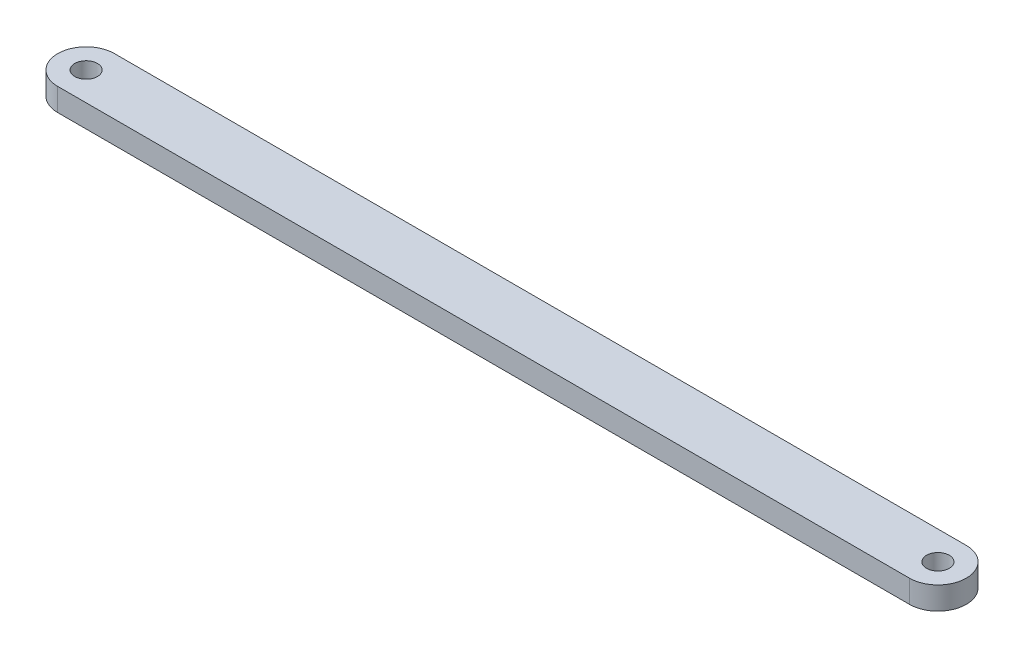
ISO-10303-21;
HEADER;
FILE_DESCRIPTION(('STEP AP214'),'2;1');
FILE_NAME('part.step','',(''),(''),'','','');
FILE_SCHEMA(('AUTOMOTIVE_DESIGN { 1 0 10303 214 1 1 1 1 }'));
ENDSEC;
DATA;
#1=APPLICATION_CONTEXT('core data for automotive mechanical design processes');
#2=APPLICATION_PROTOCOL_DEFINITION('international standard','automotive_design',2000,#1);
#3=PRODUCT_CONTEXT('',#1,'mechanical');
#4=PRODUCT('Part','Part','',(#3));
#5=PRODUCT_RELATED_PRODUCT_CATEGORY('part','',(#4));
#6=PRODUCT_DEFINITION_FORMATION('','',#4);
#7=PRODUCT_DEFINITION_CONTEXT('part definition',#1,'design');
#8=PRODUCT_DEFINITION('design','',#6,#7);
#9=PRODUCT_DEFINITION_SHAPE('','',#8);
#10=(LENGTH_UNIT() NAMED_UNIT(*) SI_UNIT(.MILLI.,.METRE.));
#11=(NAMED_UNIT(*) PLANE_ANGLE_UNIT() SI_UNIT($,.RADIAN.));
#12=(NAMED_UNIT(*) SI_UNIT($,.STERADIAN.) SOLID_ANGLE_UNIT());
#13=UNCERTAINTY_MEASURE_WITH_UNIT(LENGTH_MEASURE(1.E-05),#10,'distance_accuracy_value','');
#14=(GEOMETRIC_REPRESENTATION_CONTEXT(3) GLOBAL_UNCERTAINTY_ASSIGNED_CONTEXT((#13)) GLOBAL_UNIT_ASSIGNED_CONTEXT((#10,
#11,#12)) REPRESENTATION_CONTEXT('',''));
#15=CARTESIAN_POINT('',(0.,0.,0.));
#16=DIRECTION('',(0.,0.,1.));
#17=DIRECTION('',(1.,0.,0.));
#18=AXIS2_PLACEMENT_3D('',#15,#16,#17);
#19=CARTESIAN_POINT('',(-10.,2.,0.));
#20=DIRECTION('',(0.,1.,0.));
#21=DIRECTION('',(0.,0.,1.));
#22=AXIS2_PLACEMENT_3D('',#19,#20,#21);
#23=PLANE('',#22);
#24=CARTESIAN_POINT('',(65.,2.,0.));
#25=DIRECTION('',(0.,1.,0.));
#26=DIRECTION('',(0.,0.,1.));
#27=AXIS2_PLACEMENT_3D('',#24,#25,#26);
#28=CIRCLE('',#27,0.999999999999998);
#29=CARTESIAN_POINT('',(65.,2.,0.999999999999998));
#30=VERTEX_POINT('',#29);
#31=EDGE_CURVE('E104',#30,#30,#28,.T.);
#32=ORIENTED_EDGE('',*,*,#31,.F.);
#33=EDGE_LOOP('',(#32));
#34=FACE_BOUND('',#33,.T.);
#35=CARTESIAN_POINT('',(-10.,2.,0.));
#36=DIRECTION('',(0.,1.,0.));
#37=DIRECTION('',(0.,0.,1.));
#38=AXIS2_PLACEMENT_3D('',#35,#36,#37);
#39=CIRCLE('',#38,2.5);
#40=CARTESIAN_POINT('',(-10.,2.,-2.5));
#41=VERTEX_POINT('',#40);
#42=CARTESIAN_POINT('',(-10.,2.,2.5));
#43=VERTEX_POINT('',#42);
#44=EDGE_CURVE('E89',#41,#43,#39,.T.);
#45=ORIENTED_EDGE('',*,*,#44,.T.);
#46=DIRECTION('',(1.,0.,0.));
#47=VECTOR('',#46,1.);
#48=CARTESIAN_POINT('',(-10.,2.,2.5));
#49=LINE('',#48,#47);
#50=CARTESIAN_POINT('',(65.,2.,2.5));
#51=VERTEX_POINT('',#50);
#52=EDGE_CURVE('E84',#43,#51,#49,.T.);
#53=ORIENTED_EDGE('',*,*,#52,.T.);
#54=CARTESIAN_POINT('',(65.,2.,0.));
#55=DIRECTION('',(0.,1.,0.));
#56=DIRECTION('',(0.,0.,1.));
#57=AXIS2_PLACEMENT_3D('',#54,#55,#56);
#58=CIRCLE('',#57,2.5);
#59=CARTESIAN_POINT('',(65.,2.,-2.5));
#60=VERTEX_POINT('',#59);
#61=EDGE_CURVE('E87',#51,#60,#58,.T.);
#62=ORIENTED_EDGE('',*,*,#61,.T.);
#63=DIRECTION('',(-1.,0.,0.));
#64=VECTOR('',#63,1.);
#65=CARTESIAN_POINT('',(-10.,2.,-2.5));
#66=LINE('',#65,#64);
#67=EDGE_CURVE('E54',#60,#41,#66,.T.);
#68=ORIENTED_EDGE('',*,*,#67,.T.);
#69=EDGE_LOOP('',(#45,#53,#62,#68));
#70=FACE_BOUND('',#69,.T.);
#71=CARTESIAN_POINT('',(-10.,2.,0.));
#72=DIRECTION('',(0.,1.,0.));
#73=DIRECTION('',(0.,0.,1.));
#74=AXIS2_PLACEMENT_3D('',#71,#72,#73);
#75=CIRCLE('',#74,1.);
#76=CARTESIAN_POINT('',(-10.,2.,1.));
#77=VERTEX_POINT('',#76);
#78=EDGE_CURVE('E119',#77,#77,#75,.T.);
#79=ORIENTED_EDGE('',*,*,#78,.F.);
#80=EDGE_LOOP('',(#79));
#81=FACE_BOUND('',#80,.T.);
#82=ADVANCED_FACE('F37',(#34,#70,#81),#23,.T.);
#83=CARTESIAN_POINT('',(-10.,0.,0.));
#84=DIRECTION('',(0.,1.,0.));
#85=DIRECTION('',(0.,0.,1.));
#86=AXIS2_PLACEMENT_3D('',#83,#84,#85);
#87=PLANE('',#86);
#88=CARTESIAN_POINT('',(-10.,0.,0.));
#89=DIRECTION('',(0.,1.,0.));
#90=DIRECTION('',(0.,0.,1.));
#91=AXIS2_PLACEMENT_3D('',#88,#89,#90);
#92=CIRCLE('',#91,2.5);
#93=CARTESIAN_POINT('',(-10.,0.,-2.5));
#94=VERTEX_POINT('',#93);
#95=CARTESIAN_POINT('',(-10.,0.,2.5));
#96=VERTEX_POINT('',#95);
#97=EDGE_CURVE('E101',#94,#96,#92,.T.);
#98=ORIENTED_EDGE('',*,*,#97,.F.);
#99=DIRECTION('',(-1.,0.,0.));
#100=VECTOR('',#99,1.);
#101=CARTESIAN_POINT('',(-10.,0.,-2.5));
#102=LINE('',#101,#100);
#103=CARTESIAN_POINT('',(65.,0.,-2.5));
#104=VERTEX_POINT('',#103);
#105=EDGE_CURVE('E77',#104,#94,#102,.T.);
#106=ORIENTED_EDGE('',*,*,#105,.F.);
#107=CARTESIAN_POINT('',(65.,0.,0.));
#108=DIRECTION('',(0.,1.,0.));
#109=DIRECTION('',(0.,0.,1.));
#110=AXIS2_PLACEMENT_3D('',#107,#108,#109);
#111=CIRCLE('',#110,2.5);
#112=CARTESIAN_POINT('',(65.,0.,2.5));
#113=VERTEX_POINT('',#112);
#114=EDGE_CURVE('E71',#113,#104,#111,.T.);
#115=ORIENTED_EDGE('',*,*,#114,.F.);
#116=DIRECTION('',(1.,0.,0.));
#117=VECTOR('',#116,1.);
#118=CARTESIAN_POINT('',(-10.,0.,2.5));
#119=LINE('',#118,#117);
#120=EDGE_CURVE('E93',#96,#113,#119,.T.);
#121=ORIENTED_EDGE('',*,*,#120,.F.);
#122=EDGE_LOOP('',(#98,#106,#115,#121));
#123=FACE_BOUND('',#122,.T.);
#124=CARTESIAN_POINT('',(65.,0.,0.));
#125=DIRECTION('',(0.,1.,0.));
#126=DIRECTION('',(0.,0.,1.));
#127=AXIS2_PLACEMENT_3D('',#124,#125,#126);
#128=CIRCLE('',#127,0.999999999999998);
#129=CARTESIAN_POINT('',(65.,0.,0.999999999999998));
#130=VERTEX_POINT('',#129);
#131=EDGE_CURVE('E116',#130,#130,#128,.T.);
#132=ORIENTED_EDGE('',*,*,#131,.T.);
#133=EDGE_LOOP('',(#132));
#134=FACE_BOUND('',#133,.T.);
#135=CARTESIAN_POINT('',(-10.,0.,0.));
#136=DIRECTION('',(0.,1.,0.));
#137=DIRECTION('',(0.,0.,1.));
#138=AXIS2_PLACEMENT_3D('',#135,#136,#137);
#139=CIRCLE('',#138,1.);
#140=CARTESIAN_POINT('',(-10.,0.,1.));
#141=VERTEX_POINT('',#140);
#142=EDGE_CURVE('E122',#141,#141,#139,.T.);
#143=ORIENTED_EDGE('',*,*,#142,.T.);
#144=EDGE_LOOP('',(#143));
#145=FACE_BOUND('',#144,.T.);
#146=ADVANCED_FACE('F112',(#123,#134,#145),#87,.F.);
#147=CARTESIAN_POINT('',(-10.,2.,0.));
#148=DIRECTION('',(0.,-1.,0.));
#149=DIRECTION('',(0.,0.,-1.));
#150=AXIS2_PLACEMENT_3D('',#147,#148,#149);
#151=CYLINDRICAL_SURFACE('',#150,2.5);
#152=ORIENTED_EDGE('',*,*,#97,.T.);
#153=DIRECTION('',(0.,-1.,0.));
#154=VECTOR('',#153,1.);
#155=CARTESIAN_POINT('',(-10.,2.,2.5));
#156=LINE('',#155,#154);
#157=EDGE_CURVE('E11',#43,#96,#156,.T.);
#158=ORIENTED_EDGE('',*,*,#157,.F.);
#159=ORIENTED_EDGE('',*,*,#44,.F.);
#160=DIRECTION('',(0.,-1.,0.));
#161=VECTOR('',#160,1.);
#162=CARTESIAN_POINT('',(-10.,2.,-2.5));
#163=LINE('',#162,#161);
#164=EDGE_CURVE('E97',#41,#94,#163,.T.);
#165=ORIENTED_EDGE('',*,*,#164,.T.);
#166=EDGE_LOOP('',(#152,#158,#159,#165));
#167=FACE_BOUND('',#166,.T.);
#168=ADVANCED_FACE('F39',(#167),#151,.T.);
#169=CARTESIAN_POINT('',(-10.,2.,2.5));
#170=DIRECTION('',(0.,0.,-1.));
#171=DIRECTION('',(-1.,0.,0.));
#172=AXIS2_PLACEMENT_3D('',#169,#170,#171);
#173=PLANE('',#172);
#174=ORIENTED_EDGE('',*,*,#120,.T.);
#175=DIRECTION('',(0.,-1.,0.));
#176=VECTOR('',#175,1.);
#177=CARTESIAN_POINT('',(65.,2.,2.5));
#178=LINE('',#177,#176);
#179=EDGE_CURVE('E46',#51,#113,#178,.T.);
#180=ORIENTED_EDGE('',*,*,#179,.F.);
#181=ORIENTED_EDGE('',*,*,#52,.F.);
#182=ORIENTED_EDGE('',*,*,#157,.T.);
#183=EDGE_LOOP('',(#174,#180,#181,#182));
#184=FACE_BOUND('',#183,.T.);
#185=ADVANCED_FACE('F92',(#184),#173,.F.);
#186=CARTESIAN_POINT('',(65.,2.,0.));
#187=DIRECTION('',(0.,-1.,0.));
#188=DIRECTION('',(0.,0.,-1.));
#189=AXIS2_PLACEMENT_3D('',#186,#187,#188);
#190=CYLINDRICAL_SURFACE('',#189,2.5);
#191=ORIENTED_EDGE('',*,*,#114,.T.);
#192=DIRECTION('',(0.,-1.,0.));
#193=VECTOR('',#192,1.);
#194=CARTESIAN_POINT('',(65.,2.,-2.5));
#195=LINE('',#194,#193);
#196=EDGE_CURVE('E94',#60,#104,#195,.T.);
#197=ORIENTED_EDGE('',*,*,#196,.F.);
#198=ORIENTED_EDGE('',*,*,#61,.F.);
#199=ORIENTED_EDGE('',*,*,#179,.T.);
#200=EDGE_LOOP('',(#191,#197,#198,#199));
#201=FACE_BOUND('',#200,.T.);
#202=ADVANCED_FACE('F95',(#201),#190,.T.);
#203=CARTESIAN_POINT('',(-10.,2.,-2.5));
#204=DIRECTION('',(0.,0.,1.));
#205=DIRECTION('',(1.,0.,0.));
#206=AXIS2_PLACEMENT_3D('',#203,#204,#205);
#207=PLANE('',#206);
#208=ORIENTED_EDGE('',*,*,#105,.T.);
#209=ORIENTED_EDGE('',*,*,#164,.F.);
#210=ORIENTED_EDGE('',*,*,#67,.F.);
#211=ORIENTED_EDGE('',*,*,#196,.T.);
#212=EDGE_LOOP('',(#208,#209,#210,#211));
#213=FACE_BOUND('',#212,.T.);
#214=ADVANCED_FACE('F109',(#213),#207,.F.);
#215=CARTESIAN_POINT('',(65.,2.,0.));
#216=DIRECTION('',(0.,-1.,0.));
#217=DIRECTION('',(0.,0.,-1.));
#218=AXIS2_PLACEMENT_3D('',#215,#216,#217);
#219=CYLINDRICAL_SURFACE('',#218,0.999999999999998);
#220=ORIENTED_EDGE('',*,*,#31,.T.);
#221=EDGE_LOOP('',(#220));
#222=FACE_BOUND('',#221,.T.);
#223=ORIENTED_EDGE('',*,*,#131,.F.);
#224=EDGE_LOOP('',(#223));
#225=FACE_BOUND('',#224,.T.);
#226=ADVANCED_FACE('F139',(#222,#225),#219,.F.);
#227=CARTESIAN_POINT('',(-10.,2.,0.));
#228=DIRECTION('',(0.,-1.,0.));
#229=DIRECTION('',(0.,0.,-1.));
#230=AXIS2_PLACEMENT_3D('',#227,#228,#229);
#231=CYLINDRICAL_SURFACE('',#230,1.);
#232=ORIENTED_EDGE('',*,*,#78,.T.);
#233=EDGE_LOOP('',(#232));
#234=FACE_BOUND('',#233,.T.);
#235=ORIENTED_EDGE('',*,*,#142,.F.);
#236=EDGE_LOOP('',(#235));
#237=FACE_BOUND('',#236,.T.);
#238=ADVANCED_FACE('F128',(#234,#237),#231,.F.);
#239=CLOSED_SHELL('',(#82,#146,#168,#185,#202,#214,#226,#238));
#240=MANIFOLD_SOLID_BREP('B2',#239);
#241=ADVANCED_BREP_SHAPE_REPRESENTATION('',(#18,#240),#14);
#242=SHAPE_DEFINITION_REPRESENTATION(#9,#241);
ENDSEC;
END-ISO-10303-21;
